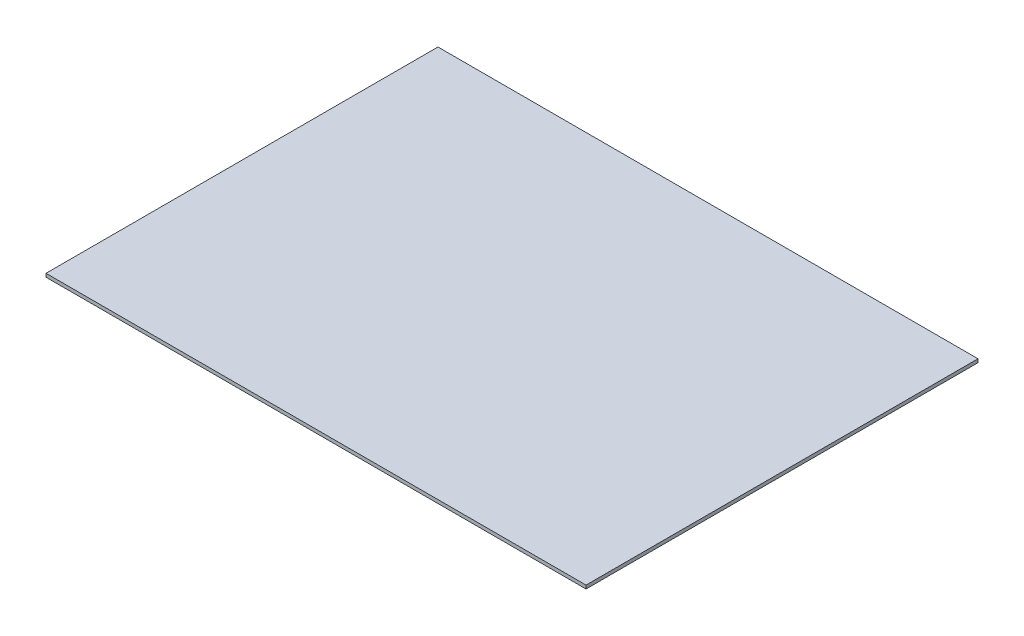
ISO-10303-21;
HEADER;
FILE_DESCRIPTION(('STEP AP214'),'2;1');
FILE_NAME('part.step','',(''),(''),'','','');
FILE_SCHEMA(('AUTOMOTIVE_DESIGN { 1 0 10303 214 1 1 1 1 }'));
ENDSEC;
DATA;
#1=APPLICATION_CONTEXT('core data for automotive mechanical design processes');
#2=APPLICATION_PROTOCOL_DEFINITION('international standard','automotive_design',2000,#1);
#3=PRODUCT_CONTEXT('',#1,'mechanical');
#4=PRODUCT('Part','Part','',(#3));
#5=PRODUCT_RELATED_PRODUCT_CATEGORY('part','',(#4));
#6=PRODUCT_DEFINITION_FORMATION('','',#4);
#7=PRODUCT_DEFINITION_CONTEXT('part definition',#1,'design');
#8=PRODUCT_DEFINITION('design','',#6,#7);
#9=PRODUCT_DEFINITION_SHAPE('','',#8);
#10=(LENGTH_UNIT() NAMED_UNIT(*) SI_UNIT(.MILLI.,.METRE.));
#11=(NAMED_UNIT(*) PLANE_ANGLE_UNIT() SI_UNIT($,.RADIAN.));
#12=(NAMED_UNIT(*) SI_UNIT($,.STERADIAN.) SOLID_ANGLE_UNIT());
#13=UNCERTAINTY_MEASURE_WITH_UNIT(LENGTH_MEASURE(1.E-05),#10,'distance_accuracy_value','');
#14=(GEOMETRIC_REPRESENTATION_CONTEXT(3) GLOBAL_UNCERTAINTY_ASSIGNED_CONTEXT((#13)) GLOBAL_UNIT_ASSIGNED_CONTEXT((#10,
#11,#12)) REPRESENTATION_CONTEXT('',''));
#15=CARTESIAN_POINT('',(0.,0.,0.));
#16=DIRECTION('',(0.,0.,1.));
#17=DIRECTION('',(1.,0.,0.));
#18=AXIS2_PLACEMENT_3D('',#15,#16,#17);
#19=CARTESIAN_POINT('',(315.5,4.,229.));
#20=DIRECTION('',(-1.,0.,0.));
#21=DIRECTION('',(0.,0.,1.));
#22=AXIS2_PLACEMENT_3D('',#19,#20,#21);
#23=PLANE('',#22);
#24=DIRECTION('',(0.,0.,-1.));
#25=VECTOR('',#24,1.);
#26=CARTESIAN_POINT('',(315.5,0.,229.));
#27=LINE('',#26,#25);
#28=CARTESIAN_POINT('',(315.5,0.,229.));
#29=VERTEX_POINT('',#28);
#30=CARTESIAN_POINT('',(315.5,0.,-229.));
#31=VERTEX_POINT('',#30);
#32=EDGE_CURVE('E103',#29,#31,#27,.T.);
#33=ORIENTED_EDGE('',*,*,#32,.T.);
#34=DIRECTION('',(0.,-1.,0.));
#35=VECTOR('',#34,1.);
#36=CARTESIAN_POINT('',(315.5,4.,-229.));
#37=LINE('',#36,#35);
#38=CARTESIAN_POINT('',(315.5,4.,-229.));
#39=VERTEX_POINT('',#38);
#40=EDGE_CURVE('E11',#39,#31,#37,.T.);
#41=ORIENTED_EDGE('',*,*,#40,.F.);
#42=DIRECTION('',(0.,0.,-1.));
#43=VECTOR('',#42,1.);
#44=CARTESIAN_POINT('',(315.5,4.,229.));
#45=LINE('',#44,#43);
#46=CARTESIAN_POINT('',(315.5,4.,229.));
#47=VERTEX_POINT('',#46);
#48=EDGE_CURVE('E91',#47,#39,#45,.T.);
#49=ORIENTED_EDGE('',*,*,#48,.F.);
#50=DIRECTION('',(0.,-1.,0.));
#51=VECTOR('',#50,1.);
#52=CARTESIAN_POINT('',(315.5,4.,229.));
#53=LINE('',#52,#51);
#54=EDGE_CURVE('E99',#47,#29,#53,.T.);
#55=ORIENTED_EDGE('',*,*,#54,.T.);
#56=EDGE_LOOP('',(#33,#41,#49,#55));
#57=FACE_BOUND('',#56,.T.);
#58=ADVANCED_FACE('F40',(#57),#23,.F.);
#59=CARTESIAN_POINT('',(-315.5,4.,-229.));
#60=DIRECTION('',(0.,0.,1.));
#61=DIRECTION('',(1.,0.,0.));
#62=AXIS2_PLACEMENT_3D('',#59,#60,#61);
#63=PLANE('',#62);
#64=DIRECTION('',(-1.,0.,0.));
#65=VECTOR('',#64,1.);
#66=CARTESIAN_POINT('',(-315.5,0.,-229.));
#67=LINE('',#66,#65);
#68=CARTESIAN_POINT('',(-315.5,0.,-229.));
#69=VERTEX_POINT('',#68);
#70=EDGE_CURVE('E95',#31,#69,#67,.T.);
#71=ORIENTED_EDGE('',*,*,#70,.T.);
#72=DIRECTION('',(0.,-1.,0.));
#73=VECTOR('',#72,1.);
#74=CARTESIAN_POINT('',(-315.5,4.,-229.));
#75=LINE('',#74,#73);
#76=CARTESIAN_POINT('',(-315.5,4.,-229.));
#77=VERTEX_POINT('',#76);
#78=EDGE_CURVE('E48',#77,#69,#75,.T.);
#79=ORIENTED_EDGE('',*,*,#78,.F.);
#80=DIRECTION('',(-1.,0.,0.));
#81=VECTOR('',#80,1.);
#82=CARTESIAN_POINT('',(-315.5,4.,-229.));
#83=LINE('',#82,#81);
#84=EDGE_CURVE('E86',#39,#77,#83,.T.);
#85=ORIENTED_EDGE('',*,*,#84,.F.);
#86=ORIENTED_EDGE('',*,*,#40,.T.);
#87=EDGE_LOOP('',(#71,#79,#85,#86));
#88=FACE_BOUND('',#87,.T.);
#89=ADVANCED_FACE('F94',(#88),#63,.F.);
#90=CARTESIAN_POINT('',(-315.5,4.,229.));
#91=DIRECTION('',(1.,0.,0.));
#92=DIRECTION('',(0.,0.,-1.));
#93=AXIS2_PLACEMENT_3D('',#90,#91,#92);
#94=PLANE('',#93);
#95=DIRECTION('',(0.,0.,1.));
#96=VECTOR('',#95,1.);
#97=CARTESIAN_POINT('',(-315.5,0.,229.));
#98=LINE('',#97,#96);
#99=CARTESIAN_POINT('',(-315.5,0.,229.));
#100=VERTEX_POINT('',#99);
#101=EDGE_CURVE('E73',#69,#100,#98,.T.);
#102=ORIENTED_EDGE('',*,*,#101,.T.);
#103=DIRECTION('',(0.,-1.,0.));
#104=VECTOR('',#103,1.);
#105=CARTESIAN_POINT('',(-315.5,4.,229.));
#106=LINE('',#105,#104);
#107=CARTESIAN_POINT('',(-315.5,4.,229.));
#108=VERTEX_POINT('',#107);
#109=EDGE_CURVE('E96',#108,#100,#106,.T.);
#110=ORIENTED_EDGE('',*,*,#109,.F.);
#111=DIRECTION('',(0.,0.,1.));
#112=VECTOR('',#111,1.);
#113=CARTESIAN_POINT('',(-315.5,4.,229.));
#114=LINE('',#113,#112);
#115=EDGE_CURVE('E89',#77,#108,#114,.T.);
#116=ORIENTED_EDGE('',*,*,#115,.F.);
#117=ORIENTED_EDGE('',*,*,#78,.T.);
#118=EDGE_LOOP('',(#102,#110,#116,#117));
#119=FACE_BOUND('',#118,.T.);
#120=ADVANCED_FACE('F97',(#119),#94,.F.);
#121=CARTESIAN_POINT('',(-315.5,4.,229.));
#122=DIRECTION('',(0.,0.,-1.));
#123=DIRECTION('',(-1.,0.,0.));
#124=AXIS2_PLACEMENT_3D('',#121,#122,#123);
#125=PLANE('',#124);
#126=DIRECTION('',(1.,0.,0.));
#127=VECTOR('',#126,1.);
#128=CARTESIAN_POINT('',(-315.5,0.,229.));
#129=LINE('',#128,#127);
#130=EDGE_CURVE('E79',#100,#29,#129,.T.);
#131=ORIENTED_EDGE('',*,*,#130,.T.);
#132=ORIENTED_EDGE('',*,*,#54,.F.);
#133=DIRECTION('',(1.,0.,0.));
#134=VECTOR('',#133,1.);
#135=CARTESIAN_POINT('',(-315.5,4.,229.));
#136=LINE('',#135,#134);
#137=EDGE_CURVE('E56',#108,#47,#136,.T.);
#138=ORIENTED_EDGE('',*,*,#137,.F.);
#139=ORIENTED_EDGE('',*,*,#109,.T.);
#140=EDGE_LOOP('',(#131,#132,#138,#139));
#141=FACE_BOUND('',#140,.T.);
#142=ADVANCED_FACE('F110',(#141),#125,.F.);
#143=CARTESIAN_POINT('',(0.,4.,0.));
#144=DIRECTION('',(0.,-1.,0.));
#145=DIRECTION('',(0.,0.,-1.));
#146=AXIS2_PLACEMENT_3D('',#143,#144,#145);
#147=PLANE('',#146);
#148=ORIENTED_EDGE('',*,*,#48,.T.);
#149=ORIENTED_EDGE('',*,*,#84,.T.);
#150=ORIENTED_EDGE('',*,*,#115,.T.);
#151=ORIENTED_EDGE('',*,*,#137,.T.);
#152=EDGE_LOOP('',(#148,#149,#150,#151));
#153=FACE_BOUND('',#152,.T.);
#154=ADVANCED_FACE('F87',(#153),#147,.F.);
#155=CARTESIAN_POINT('',(0.,0.,0.));
#156=DIRECTION('',(0.,-1.,0.));
#157=DIRECTION('',(0.,0.,-1.));
#158=AXIS2_PLACEMENT_3D('',#155,#156,#157);
#159=PLANE('',#158);
#160=ORIENTED_EDGE('',*,*,#32,.F.);
#161=ORIENTED_EDGE('',*,*,#130,.F.);
#162=ORIENTED_EDGE('',*,*,#101,.F.);
#163=ORIENTED_EDGE('',*,*,#70,.F.);
#164=EDGE_LOOP('',(#160,#161,#162,#163));
#165=FACE_BOUND('',#164,.T.);
#166=ADVANCED_FACE('F113',(#165),#159,.T.);
#167=CLOSED_SHELL('',(#58,#89,#120,#142,#154,#166));
#168=MANIFOLD_SOLID_BREP('B2',#167);
#169=ADVANCED_BREP_SHAPE_REPRESENTATION('',(#18,#168),#14);
#170=SHAPE_DEFINITION_REPRESENTATION(#9,#169);
ENDSEC;
END-ISO-10303-21;
